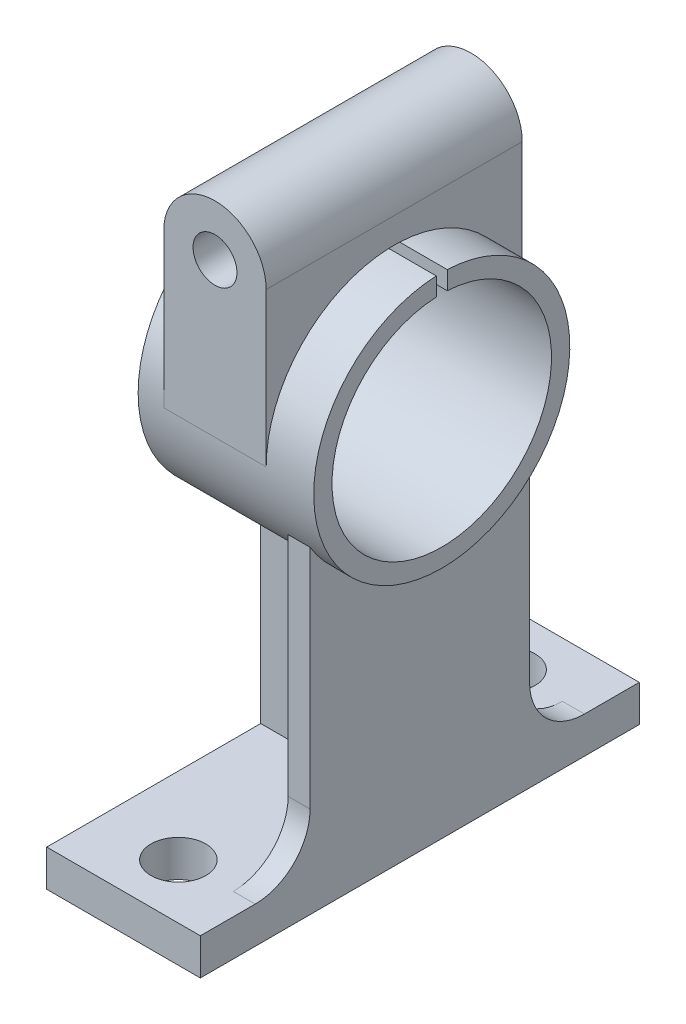
ISO-10303-21;
HEADER;
FILE_DESCRIPTION(('STEP AP214'),'2;1');
FILE_NAME('part.step','',(''),(''),'','','');
FILE_SCHEMA(('AUTOMOTIVE_DESIGN { 1 0 10303 214 1 1 1 1 }'));
ENDSEC;
DATA;
#1=APPLICATION_CONTEXT('core data for automotive mechanical design processes');
#2=APPLICATION_PROTOCOL_DEFINITION('international standard','automotive_design',2000,#1);
#3=PRODUCT_CONTEXT('',#1,'mechanical');
#4=PRODUCT('Part','Part','',(#3));
#5=PRODUCT_RELATED_PRODUCT_CATEGORY('part','',(#4));
#6=PRODUCT_DEFINITION_FORMATION('','',#4);
#7=PRODUCT_DEFINITION_CONTEXT('part definition',#1,'design');
#8=PRODUCT_DEFINITION('design','',#6,#7);
#9=PRODUCT_DEFINITION_SHAPE('','',#8);
#10=(LENGTH_UNIT() NAMED_UNIT(*) SI_UNIT(.MILLI.,.METRE.));
#11=(NAMED_UNIT(*) PLANE_ANGLE_UNIT() SI_UNIT($,.RADIAN.));
#12=(NAMED_UNIT(*) SI_UNIT($,.STERADIAN.) SOLID_ANGLE_UNIT());
#13=UNCERTAINTY_MEASURE_WITH_UNIT(LENGTH_MEASURE(1.E-05),#10,'distance_accuracy_value','');
#14=(GEOMETRIC_REPRESENTATION_CONTEXT(3) GLOBAL_UNCERTAINTY_ASSIGNED_CONTEXT((#13)) GLOBAL_UNIT_ASSIGNED_CONTEXT((#10,
#11,#12)) REPRESENTATION_CONTEXT('',''));
#15=CARTESIAN_POINT('',(0.,0.,0.));
#16=DIRECTION('',(0.,0.,1.));
#17=DIRECTION('',(1.,0.,0.));
#18=AXIS2_PLACEMENT_3D('',#15,#16,#17);
#19=CARTESIAN_POINT('',(0.,10.,0.));
#20=DIRECTION('',(0.,-1.,0.));
#21=DIRECTION('',(0.,0.,-1.));
#22=AXIS2_PLACEMENT_3D('',#19,#20,#21);
#23=PLANE('',#22);
#24=CARTESIAN_POINT('',(21.,10.,-15.));
#25=DIRECTION('',(0.,1.,0.));
#26=DIRECTION('',(0.,0.,1.));
#27=AXIS2_PLACEMENT_3D('',#24,#25,#26);
#28=CIRCLE('',#27,7.5);
#29=CARTESIAN_POINT('',(21.,10.,-7.5));
#30=VERTEX_POINT('',#29);
#31=EDGE_CURVE('E291',#30,#30,#28,.T.);
#32=ORIENTED_EDGE('',*,*,#31,.F.);
#33=EDGE_LOOP('',(#32));
#34=FACE_BOUND('',#33,.T.);
#35=DIRECTION('',(1.,0.,0.));
#36=VECTOR('',#35,1.);
#37=CARTESIAN_POINT('',(0.,10.,-58.5));
#38=LINE('',#37,#36);
#39=CARTESIAN_POINT('',(0.,10.,-58.5));
#40=VERTEX_POINT('',#39);
#41=CARTESIAN_POINT('',(36.,10.,-58.5));
#42=VERTEX_POINT('',#41);
#43=EDGE_CURVE('E387',#40,#42,#38,.T.);
#44=ORIENTED_EDGE('',*,*,#43,.F.);
#45=DIRECTION('',(0.,0.,1.));
#46=VECTOR('',#45,1.);
#47=CARTESIAN_POINT('',(0.,10.,0.));
#48=LINE('',#47,#46);
#49=CARTESIAN_POINT('',(0.,10.,0.));
#50=VERTEX_POINT('',#49);
#51=EDGE_CURVE('E300',#40,#50,#48,.T.);
#52=ORIENTED_EDGE('',*,*,#51,.T.);
#53=DIRECTION('',(1.,0.,0.));
#54=VECTOR('',#53,1.);
#55=CARTESIAN_POINT('',(0.,10.,0.));
#56=LINE('',#55,#54);
#57=CARTESIAN_POINT('',(42.,10.,0.));
#58=VERTEX_POINT('',#57);
#59=EDGE_CURVE('E299',#50,#58,#56,.T.);
#60=ORIENTED_EDGE('',*,*,#59,.T.);
#61=DIRECTION('',(0.,0.,-1.));
#62=VECTOR('',#61,1.);
#63=CARTESIAN_POINT('',(42.,10.,0.));
#64=LINE('',#63,#62);
#65=CARTESIAN_POINT('',(42.,10.,-15.));
#66=VERTEX_POINT('',#65);
#67=EDGE_CURVE('E303',#58,#66,#64,.T.);
#68=ORIENTED_EDGE('',*,*,#67,.T.);
#69=DIRECTION('',(1.,0.,0.));
#70=VECTOR('',#69,1.);
#71=CARTESIAN_POINT('',(36.,10.,-14.9999999999999));
#72=LINE('',#71,#70);
#73=CARTESIAN_POINT('',(36.,10.,-14.9999999999999));
#74=VERTEX_POINT('',#73);
#75=EDGE_CURVE('E278',#74,#66,#72,.T.);
#76=ORIENTED_EDGE('',*,*,#75,.F.);
#77=DIRECTION('',(0.,0.,-1.));
#78=VECTOR('',#77,1.);
#79=CARTESIAN_POINT('',(36.,10.,-14.9999999999999));
#80=LINE('',#79,#78);
#81=EDGE_CURVE('E244',#74,#42,#80,.T.);
#82=ORIENTED_EDGE('',*,*,#81,.T.);
#83=EDGE_LOOP('',(#44,#52,#60,#68,#76,#82));
#84=FACE_BOUND('',#83,.T.);
#85=ADVANCED_FACE('F33',(#34,#84),#23,.F.);
#86=CARTESIAN_POINT('',(21.,10.,-105.));
#87=DIRECTION('',(0.,1.,0.));
#88=DIRECTION('',(0.,0.,-1.));
#89=AXIS2_PLACEMENT_3D('',#86,#87,#88);
#90=CIRCLE('',#89,7.5);
#91=CARTESIAN_POINT('',(21.,10.,-112.5));
#92=VERTEX_POINT('',#91);
#93=EDGE_CURVE('E285',#92,#92,#90,.T.);
#94=ORIENTED_EDGE('',*,*,#93,.F.);
#95=EDGE_LOOP('',(#94));
#96=FACE_BOUND('',#95,.T.);
#97=DIRECTION('',(1.,0.,0.));
#98=VECTOR('',#97,1.);
#99=CARTESIAN_POINT('',(0.,10.,-61.5));
#100=LINE('',#99,#98);
#101=CARTESIAN_POINT('',(0.,10.,-61.5));
#102=VERTEX_POINT('',#101);
#103=CARTESIAN_POINT('',(36.,10.,-61.5));
#104=VERTEX_POINT('',#103);
#105=EDGE_CURVE('E389',#102,#104,#100,.T.);
#106=ORIENTED_EDGE('',*,*,#105,.T.);
#107=CARTESIAN_POINT('',(36.,10.,-105.));
#108=VERTEX_POINT('',#107);
#109=EDGE_CURVE('E243',#104,#108,#80,.T.);
#110=ORIENTED_EDGE('',*,*,#109,.T.);
#111=DIRECTION('',(1.,0.,0.));
#112=VECTOR('',#111,1.);
#113=CARTESIAN_POINT('',(36.,10.,-105.));
#114=LINE('',#113,#112);
#115=CARTESIAN_POINT('',(42.,10.,-105.));
#116=VERTEX_POINT('',#115);
#117=EDGE_CURVE('E275',#108,#116,#114,.T.);
#118=ORIENTED_EDGE('',*,*,#117,.T.);
#119=CARTESIAN_POINT('',(42.,10.,-120.));
#120=VERTEX_POINT('',#119);
#121=EDGE_CURVE('E302',#116,#120,#64,.T.);
#122=ORIENTED_EDGE('',*,*,#121,.T.);
#123=DIRECTION('',(-1.,0.,0.));
#124=VECTOR('',#123,1.);
#125=CARTESIAN_POINT('',(0.,10.,-120.));
#126=LINE('',#125,#124);
#127=CARTESIAN_POINT('',(0.,10.,-120.));
#128=VERTEX_POINT('',#127);
#129=EDGE_CURVE('E305',#120,#128,#126,.T.);
#130=ORIENTED_EDGE('',*,*,#129,.T.);
#131=EDGE_CURVE('E297',#128,#102,#48,.T.);
#132=ORIENTED_EDGE('',*,*,#131,.T.);
#133=EDGE_LOOP('',(#106,#110,#118,#122,#130,#132));
#134=FACE_BOUND('',#133,.T.);
#135=ADVANCED_FACE('F347',(#96,#134),#23,.F.);
#136=CARTESIAN_POINT('',(36.,105.,-60.));
#137=DIRECTION('',(1.,0.,0.));
#138=DIRECTION('',(0.,0.,-1.));
#139=AXIS2_PLACEMENT_3D('',#136,#137,#138);
#140=PLANE('',#139);
#141=DIRECTION('',(0.,1.,0.));
#142=VECTOR('',#141,1.);
#143=CARTESIAN_POINT('',(36.,70.0321576301883,-58.5));
#144=LINE('',#143,#142);
#145=CARTESIAN_POINT('',(36.,70.0321576301883,-58.5));
#146=VERTEX_POINT('',#145);
#147=EDGE_CURVE('E375',#42,#146,#144,.T.);
#148=ORIENTED_EDGE('',*,*,#147,.F.);
#149=ORIENTED_EDGE('',*,*,#81,.F.);
#150=CARTESIAN_POINT('',(36.,25.,-15.));
#151=DIRECTION('',(-1.,0.,0.));
#152=DIRECTION('',(0.,0.,1.));
#153=AXIS2_PLACEMENT_3D('',#150,#151,#152);
#154=CIRCLE('',#153,15.);
#155=CARTESIAN_POINT('',(36.,25.0000000000001,-30.));
#156=VERTEX_POINT('',#155);
#157=EDGE_CURVE('E240',#156,#74,#154,.T.);
#158=ORIENTED_EDGE('',*,*,#157,.F.);
#159=DIRECTION('',(0.,-1.,0.));
#160=VECTOR('',#159,1.);
#161=CARTESIAN_POINT('',(36.,25.0000000000001,-30.));
#162=LINE('',#161,#160);
#163=CARTESIAN_POINT('',(36.,86.9722436226802,-29.9999999999999));
#164=VERTEX_POINT('',#163);
#165=EDGE_CURVE('E236',#164,#156,#162,.T.);
#166=ORIENTED_EDGE('',*,*,#165,.F.);
#167=CARTESIAN_POINT('',(36.,105.,-60.));
#168=DIRECTION('',(-1.,0.,0.));
#169=DIRECTION('',(0.,0.,-1.));
#170=AXIS2_PLACEMENT_3D('',#167,#168,#169);
#171=CIRCLE('',#170,35.);
#172=EDGE_CURVE('E237',#146,#164,#171,.T.);
#173=ORIENTED_EDGE('',*,*,#172,.F.);
#174=EDGE_LOOP('',(#148,#149,#158,#166,#173));
#175=FACE_BOUND('',#174,.T.);
#176=ADVANCED_FACE('F372',(#175),#140,.F.);
#177=DIRECTION('',(0.,-1.,0.));
#178=VECTOR('',#177,1.);
#179=CARTESIAN_POINT('',(36.,70.0321576301883,-61.5));
#180=LINE('',#179,#178);
#181=CARTESIAN_POINT('',(36.,70.0321576301883,-61.5));
#182=VERTEX_POINT('',#181);
#183=EDGE_CURVE('E378',#182,#104,#180,.T.);
#184=ORIENTED_EDGE('',*,*,#183,.F.);
#185=CARTESIAN_POINT('',(36.,86.97224362268,-89.9999999999996));
#186=VERTEX_POINT('',#185);
#187=EDGE_CURVE('E233',#186,#182,#171,.T.);
#188=ORIENTED_EDGE('',*,*,#187,.F.);
#189=DIRECTION('',(0.,1.,0.));
#190=VECTOR('',#189,1.);
#191=CARTESIAN_POINT('',(36.,25.0000000000001,-90.));
#192=LINE('',#191,#190);
#193=CARTESIAN_POINT('',(36.,25.0000000000001,-90.));
#194=VERTEX_POINT('',#193);
#195=EDGE_CURVE('E250',#194,#186,#192,.T.);
#196=ORIENTED_EDGE('',*,*,#195,.F.);
#197=CARTESIAN_POINT('',(36.,25.,-105.));
#198=DIRECTION('',(-1.,0.,0.));
#199=DIRECTION('',(0.,0.,-1.));
#200=AXIS2_PLACEMENT_3D('',#197,#198,#199);
#201=CIRCLE('',#200,15.);
#202=EDGE_CURVE('E247',#108,#194,#201,.T.);
#203=ORIENTED_EDGE('',*,*,#202,.F.);
#204=ORIENTED_EDGE('',*,*,#109,.F.);
#205=EDGE_LOOP('',(#184,#188,#196,#203,#204));
#206=FACE_BOUND('',#205,.T.);
#207=ADVANCED_FACE('F469',(#206),#140,.F.);
#208=CARTESIAN_POINT('',(0.,105.,-60.));
#209=DIRECTION('',(1.,0.,0.));
#210=DIRECTION('',(0.,0.,-1.));
#211=AXIS2_PLACEMENT_3D('',#208,#209,#210);
#212=CYLINDRICAL_SURFACE('',#211,35.);
#213=CARTESIAN_POINT('',(35.,105.,-60.));
#214=DIRECTION('',(1.,0.,0.));
#215=DIRECTION('',(0.,0.,-1.));
#216=AXIS2_PLACEMENT_3D('',#213,#214,#215);
#217=CIRCLE('',#216,35.);
#218=CARTESIAN_POINT('',(35.,105.,-25.));
#219=VERTEX_POINT('',#218);
#220=CARTESIAN_POINT('',(35.,139.967842369812,-58.5));
#221=VERTEX_POINT('',#220);
#222=EDGE_CURVE('E210',#219,#221,#217,.F.);
#223=ORIENTED_EDGE('',*,*,#222,.F.);
#224=DIRECTION('',(1.,0.,0.));
#225=VECTOR('',#224,1.);
#226=CARTESIAN_POINT('',(7.,105.,-25.));
#227=LINE('',#226,#225);
#228=CARTESIAN_POINT('',(7.,105.,-25.));
#229=VERTEX_POINT('',#228);
#230=EDGE_CURVE('E715',#229,#219,#227,.T.);
#231=ORIENTED_EDGE('',*,*,#230,.F.);
#232=CARTESIAN_POINT('',(7.,105.,-60.));
#233=DIRECTION('',(-1.,0.,0.));
#234=DIRECTION('',(0.,0.,1.));
#235=AXIS2_PLACEMENT_3D('',#232,#233,#234);
#236=CIRCLE('',#235,35.);
#237=CARTESIAN_POINT('',(7.,139.967842369812,-58.5));
#238=VERTEX_POINT('',#237);
#239=EDGE_CURVE('E217',#238,#229,#236,.F.);
#240=ORIENTED_EDGE('',*,*,#239,.F.);
#241=DIRECTION('',(1.,0.,0.));
#242=VECTOR('',#241,1.);
#243=CARTESIAN_POINT('',(0.,139.967842369812,-58.5));
#244=LINE('',#243,#242);
#245=CARTESIAN_POINT('',(0.,139.967842369812,-58.5));
#246=VERTEX_POINT('',#245);
#247=EDGE_CURVE('E258',#246,#238,#244,.T.);
#248=ORIENTED_EDGE('',*,*,#247,.F.);
#249=CARTESIAN_POINT('',(0.,105.,-60.));
#250=DIRECTION('',(1.,0.,0.));
#251=DIRECTION('',(0.,0.,-1.));
#252=AXIS2_PLACEMENT_3D('',#249,#250,#251);
#253=CIRCLE('',#252,35.);
#254=CARTESIAN_POINT('',(0.,70.0321576301883,-58.4999999999999));
#255=VERTEX_POINT('',#254);
#256=EDGE_CURVE('E405',#246,#255,#253,.T.);
#257=ORIENTED_EDGE('',*,*,#256,.T.);
#258=DIRECTION('',(1.,0.,0.));
#259=VECTOR('',#258,1.);
#260=CARTESIAN_POINT('',(0.,70.0321576301883,-58.4999999999999));
#261=LINE('',#260,#259);
#262=EDGE_CURVE('E393',#255,#146,#261,.T.);
#263=ORIENTED_EDGE('',*,*,#262,.T.);
#264=ORIENTED_EDGE('',*,*,#172,.T.);
#265=DIRECTION('',(1.,0.,0.));
#266=VECTOR('',#265,1.);
#267=CARTESIAN_POINT('',(36.,86.97224362268,-29.9999999999996));
#268=LINE('',#267,#266);
#269=CARTESIAN_POINT('',(42.,86.97224362268,-29.9999999999996));
#270=VERTEX_POINT('',#269);
#271=EDGE_CURVE('E253',#164,#270,#268,.T.);
#272=ORIENTED_EDGE('',*,*,#271,.T.);
#273=CARTESIAN_POINT('',(42.,105.,-60.));
#274=DIRECTION('',(-1.,0.,0.));
#275=DIRECTION('',(0.,0.,-1.));
#276=AXIS2_PLACEMENT_3D('',#273,#274,#275);
#277=CIRCLE('',#276,35.);
#278=CARTESIAN_POINT('',(42.,86.97224362268,-89.9999999999996));
#279=VERTEX_POINT('',#278);
#280=EDGE_CURVE('E254',#279,#270,#277,.T.);
#281=ORIENTED_EDGE('',*,*,#280,.F.);
#282=DIRECTION('',(1.,0.,0.));
#283=VECTOR('',#282,1.);
#284=CARTESIAN_POINT('',(36.,86.97224362268,-89.9999999999996));
#285=LINE('',#284,#283);
#286=EDGE_CURVE('E270',#186,#279,#285,.T.);
#287=ORIENTED_EDGE('',*,*,#286,.F.);
#288=ORIENTED_EDGE('',*,*,#187,.T.);
#289=DIRECTION('',(1.,0.,0.));
#290=VECTOR('',#289,1.);
#291=CARTESIAN_POINT('',(0.,70.0321576301883,-61.5));
#292=LINE('',#291,#290);
#293=CARTESIAN_POINT('',(0.,70.0321576301883,-61.5));
#294=VERTEX_POINT('',#293);
#295=EDGE_CURVE('E391',#294,#182,#292,.T.);
#296=ORIENTED_EDGE('',*,*,#295,.F.);
#297=CARTESIAN_POINT('',(0.,139.967842369812,-61.5));
#298=VERTEX_POINT('',#297);
#299=EDGE_CURVE('E404',#294,#298,#253,.T.);
#300=ORIENTED_EDGE('',*,*,#299,.T.);
#301=DIRECTION('',(1.,0.,0.));
#302=VECTOR('',#301,1.);
#303=CARTESIAN_POINT('',(0.,139.967842369812,-61.5));
#304=LINE('',#303,#302);
#305=CARTESIAN_POINT('',(7.,139.967842369812,-61.5));
#306=VERTEX_POINT('',#305);
#307=EDGE_CURVE('E223',#298,#306,#304,.T.);
#308=ORIENTED_EDGE('',*,*,#307,.T.);
#309=CARTESIAN_POINT('',(7.,105.,-95.));
#310=VERTEX_POINT('',#309);
#311=EDGE_CURVE('E48',#310,#306,#236,.F.);
#312=ORIENTED_EDGE('',*,*,#311,.F.);
#313=DIRECTION('',(1.,0.,0.));
#314=VECTOR('',#313,1.);
#315=CARTESIAN_POINT('',(7.,105.,-95.));
#316=LINE('',#315,#314);
#317=CARTESIAN_POINT('',(35.,105.,-95.));
#318=VERTEX_POINT('',#317);
#319=EDGE_CURVE('E52',#310,#318,#316,.T.);
#320=ORIENTED_EDGE('',*,*,#319,.T.);
#321=CARTESIAN_POINT('',(35.,139.967842369812,-61.5));
#322=VERTEX_POINT('',#321);
#323=EDGE_CURVE('E207',#322,#318,#217,.F.);
#324=ORIENTED_EDGE('',*,*,#323,.F.);
#325=CARTESIAN_POINT('',(48.,139.967842369812,-61.5));
#326=VERTEX_POINT('',#325);
#327=EDGE_CURVE('E215',#322,#326,#304,.T.);
#328=ORIENTED_EDGE('',*,*,#327,.T.);
#329=CARTESIAN_POINT('',(48.,105.,-60.));
#330=DIRECTION('',(1.,0.,0.));
#331=DIRECTION('',(0.,0.,-1.));
#332=AXIS2_PLACEMENT_3D('',#329,#330,#331);
#333=CIRCLE('',#332,35.);
#334=CARTESIAN_POINT('',(48.,139.967842369812,-58.5));
#335=VERTEX_POINT('',#334);
#336=EDGE_CURVE('E395',#335,#326,#333,.T.);
#337=ORIENTED_EDGE('',*,*,#336,.F.);
#338=EDGE_CURVE('E413',#221,#335,#244,.T.);
#339=ORIENTED_EDGE('',*,*,#338,.F.);
#340=EDGE_LOOP('',(#223,#231,#240,#248,#257,#263,#264,#272,#281,#287,#288,#296,#300,#308,#312,
#320,#324,#328,#337,#339));
#341=FACE_BOUND('',#340,.T.);
#342=ADVANCED_FACE('F213',(#341),#212,.T.);
#343=CARTESIAN_POINT('',(0.,0.,0.));
#344=DIRECTION('',(0.,-1.,0.));
#345=DIRECTION('',(0.,0.,-1.));
#346=AXIS2_PLACEMENT_3D('',#343,#344,#345);
#347=PLANE('',#346);
#348=CARTESIAN_POINT('',(21.,0.,-15.));
#349=DIRECTION('',(0.,1.,0.));
#350=DIRECTION('',(0.,0.,1.));
#351=AXIS2_PLACEMENT_3D('',#348,#349,#350);
#352=CIRCLE('',#351,7.5);
#353=CARTESIAN_POINT('',(21.,0.,-7.5));
#354=VERTEX_POINT('',#353);
#355=EDGE_CURVE('E288',#354,#354,#352,.T.);
#356=ORIENTED_EDGE('',*,*,#355,.T.);
#357=EDGE_LOOP('',(#356));
#358=FACE_BOUND('',#357,.T.);
#359=DIRECTION('',(0.,0.,1.));
#360=VECTOR('',#359,1.);
#361=CARTESIAN_POINT('',(0.,0.,0.));
#362=LINE('',#361,#360);
#363=CARTESIAN_POINT('',(0.,0.,-120.));
#364=VERTEX_POINT('',#363);
#365=CARTESIAN_POINT('',(0.,0.,0.));
#366=VERTEX_POINT('',#365);
#367=EDGE_CURVE('E294',#364,#366,#362,.T.);
#368=ORIENTED_EDGE('',*,*,#367,.F.);
#369=DIRECTION('',(-1.,0.,0.));
#370=VECTOR('',#369,1.);
#371=CARTESIAN_POINT('',(0.,0.,-120.));
#372=LINE('',#371,#370);
#373=CARTESIAN_POINT('',(42.,0.,-120.));
#374=VERTEX_POINT('',#373);
#375=EDGE_CURVE('E314',#374,#364,#372,.T.);
#376=ORIENTED_EDGE('',*,*,#375,.F.);
#377=DIRECTION('',(0.,0.,-1.));
#378=VECTOR('',#377,1.);
#379=CARTESIAN_POINT('',(42.,0.,0.));
#380=LINE('',#379,#378);
#381=CARTESIAN_POINT('',(42.,0.,0.));
#382=VERTEX_POINT('',#381);
#383=EDGE_CURVE('E312',#382,#374,#380,.T.);
#384=ORIENTED_EDGE('',*,*,#383,.F.);
#385=DIRECTION('',(1.,0.,0.));
#386=VECTOR('',#385,1.);
#387=CARTESIAN_POINT('',(0.,0.,0.));
#388=LINE('',#387,#386);
#389=EDGE_CURVE('E310',#366,#382,#388,.T.);
#390=ORIENTED_EDGE('',*,*,#389,.F.);
#391=EDGE_LOOP('',(#368,#376,#384,#390));
#392=FACE_BOUND('',#391,.T.);
#393=CARTESIAN_POINT('',(21.,0.,-105.));
#394=DIRECTION('',(0.,1.,0.));
#395=DIRECTION('',(0.,0.,-1.));
#396=AXIS2_PLACEMENT_3D('',#393,#394,#395);
#397=CIRCLE('',#396,7.5);
#398=CARTESIAN_POINT('',(21.,0.,-112.5));
#399=VERTEX_POINT('',#398);
#400=EDGE_CURVE('E272',#399,#399,#397,.T.);
#401=ORIENTED_EDGE('',*,*,#400,.T.);
#402=EDGE_LOOP('',(#401));
#403=FACE_BOUND('',#402,.T.);
#404=ADVANCED_FACE('F336',(#358,#392,#403),#347,.T.);
#405=CARTESIAN_POINT('',(0.,10.,0.));
#406=DIRECTION('',(1.,0.,0.));
#407=DIRECTION('',(0.,0.,-1.));
#408=AXIS2_PLACEMENT_3D('',#405,#406,#407);
#409=PLANE('',#408);
#410=ORIENTED_EDGE('',*,*,#367,.T.);
#411=DIRECTION('',(0.,-1.,0.));
#412=VECTOR('',#411,1.);
#413=CARTESIAN_POINT('',(0.,10.,0.));
#414=LINE('',#413,#412);
#415=EDGE_CURVE('E41',#50,#366,#414,.T.);
#416=ORIENTED_EDGE('',*,*,#415,.F.);
#417=ORIENTED_EDGE('',*,*,#51,.F.);
#418=DIRECTION('',(0.,1.,0.));
#419=VECTOR('',#418,1.);
#420=CARTESIAN_POINT('',(0.,70.0321576301883,-58.5));
#421=LINE('',#420,#419);
#422=EDGE_CURVE('E381',#40,#255,#421,.T.);
#423=ORIENTED_EDGE('',*,*,#422,.T.);
#424=ORIENTED_EDGE('',*,*,#256,.F.);
#425=DIRECTION('',(0.,1.,0.));
#426=VECTOR('',#425,1.);
#427=CARTESIAN_POINT('',(0.,134.962476533157,-58.5));
#428=LINE('',#427,#426);
#429=CARTESIAN_POINT('',(0.,134.962476533157,-58.5));
#430=VERTEX_POINT('',#429);
#431=EDGE_CURVE('E224',#430,#246,#428,.T.);
#432=ORIENTED_EDGE('',*,*,#431,.F.);
#433=CARTESIAN_POINT('',(0.,105.,-60.));
#434=DIRECTION('',(-1.,0.,0.));
#435=DIRECTION('',(0.,0.,-1.));
#436=AXIS2_PLACEMENT_3D('',#433,#434,#435);
#437=CIRCLE('',#436,30.);
#438=CARTESIAN_POINT('',(0.,134.962476533157,-61.5));
#439=VERTEX_POINT('',#438);
#440=EDGE_CURVE('E228',#439,#430,#437,.T.);
#441=ORIENTED_EDGE('',*,*,#440,.F.);
#442=DIRECTION('',(0.,-1.,0.));
#443=VECTOR('',#442,1.);
#444=CARTESIAN_POINT('',(0.,134.962476533157,-61.5));
#445=LINE('',#444,#443);
#446=EDGE_CURVE('E407',#298,#439,#445,.T.);
#447=ORIENTED_EDGE('',*,*,#446,.F.);
#448=ORIENTED_EDGE('',*,*,#299,.F.);
#449=DIRECTION('',(0.,-1.,0.));
#450=VECTOR('',#449,1.);
#451=CARTESIAN_POINT('',(0.,70.0321576301883,-61.5));
#452=LINE('',#451,#450);
#453=EDGE_CURVE('E384',#294,#102,#452,.T.);
#454=ORIENTED_EDGE('',*,*,#453,.T.);
#455=ORIENTED_EDGE('',*,*,#131,.F.);
#456=DIRECTION('',(0.,-1.,0.));
#457=VECTOR('',#456,1.);
#458=CARTESIAN_POINT('',(0.,10.,-120.));
#459=LINE('',#458,#457);
#460=EDGE_CURVE('E307',#128,#364,#459,.T.);
#461=ORIENTED_EDGE('',*,*,#460,.T.);
#462=EDGE_LOOP('',(#410,#416,#417,#423,#424,#432,#441,#447,#448,#454,#455,#461));
#463=FACE_BOUND('',#462,.T.);
#464=ADVANCED_FACE('F35',(#463),#409,.F.);
#465=CARTESIAN_POINT('',(0.,10.,0.));
#466=DIRECTION('',(0.,0.,-1.));
#467=DIRECTION('',(-1.,0.,0.));
#468=AXIS2_PLACEMENT_3D('',#465,#466,#467);
#469=PLANE('',#468);
#470=ORIENTED_EDGE('',*,*,#389,.T.);
#471=DIRECTION('',(0.,-1.,0.));
#472=VECTOR('',#471,1.);
#473=CARTESIAN_POINT('',(42.,10.,0.));
#474=LINE('',#473,#472);
#475=EDGE_CURVE('E321',#58,#382,#474,.T.);
#476=ORIENTED_EDGE('',*,*,#475,.F.);
#477=ORIENTED_EDGE('',*,*,#59,.F.);
#478=ORIENTED_EDGE('',*,*,#415,.T.);
#479=EDGE_LOOP('',(#470,#476,#477,#478));
#480=FACE_BOUND('',#479,.T.);
#481=ADVANCED_FACE('F327',(#480),#469,.F.);
#482=CARTESIAN_POINT('',(42.,10.,0.));
#483=DIRECTION('',(-1.,0.,0.));
#484=DIRECTION('',(0.,0.,1.));
#485=AXIS2_PLACEMENT_3D('',#482,#483,#484);
#486=PLANE('',#485);
#487=ORIENTED_EDGE('',*,*,#383,.T.);
#488=DIRECTION('',(0.,-1.,0.));
#489=VECTOR('',#488,1.);
#490=CARTESIAN_POINT('',(42.,10.,-120.));
#491=LINE('',#490,#489);
#492=EDGE_CURVE('E318',#120,#374,#491,.T.);
#493=ORIENTED_EDGE('',*,*,#492,.F.);
#494=ORIENTED_EDGE('',*,*,#121,.F.);
#495=CARTESIAN_POINT('',(42.,25.,-105.));
#496=DIRECTION('',(-1.,0.,0.));
#497=DIRECTION('',(0.,0.,-1.));
#498=AXIS2_PLACEMENT_3D('',#495,#496,#497);
#499=CIRCLE('',#498,15.);
#500=CARTESIAN_POINT('',(42.,25.0000000000001,-90.));
#501=VERTEX_POINT('',#500);
#502=EDGE_CURVE('E264',#116,#501,#499,.T.);
#503=ORIENTED_EDGE('',*,*,#502,.T.);
#504=DIRECTION('',(0.,1.,0.));
#505=VECTOR('',#504,1.);
#506=CARTESIAN_POINT('',(42.,25.0000000000001,-90.));
#507=LINE('',#506,#505);
#508=EDGE_CURVE('E267',#501,#279,#507,.T.);
#509=ORIENTED_EDGE('',*,*,#508,.T.);
#510=ORIENTED_EDGE('',*,*,#280,.T.);
#511=DIRECTION('',(0.,-1.,0.));
#512=VECTOR('',#511,1.);
#513=CARTESIAN_POINT('',(42.,25.0000000000001,-30.));
#514=LINE('',#513,#512);
#515=CARTESIAN_POINT('',(42.,25.0000000000001,-30.));
#516=VERTEX_POINT('',#515);
#517=EDGE_CURVE('E257',#270,#516,#514,.T.);
#518=ORIENTED_EDGE('',*,*,#517,.T.);
#519=CARTESIAN_POINT('',(42.,25.,-15.));
#520=DIRECTION('',(-1.,0.,0.));
#521=DIRECTION('',(0.,0.,1.));
#522=AXIS2_PLACEMENT_3D('',#519,#520,#521);
#523=CIRCLE('',#522,15.);
#524=EDGE_CURVE('E261',#516,#66,#523,.T.);
#525=ORIENTED_EDGE('',*,*,#524,.T.);
#526=ORIENTED_EDGE('',*,*,#67,.F.);
#527=ORIENTED_EDGE('',*,*,#475,.T.);
#528=EDGE_LOOP('',(#487,#493,#494,#503,#509,#510,#518,#525,#526,#527));
#529=FACE_BOUND('',#528,.T.);
#530=ADVANCED_FACE('F341',(#529),#486,.F.);
#531=CARTESIAN_POINT('',(0.,10.,-120.));
#532=DIRECTION('',(0.,0.,1.));
#533=DIRECTION('',(1.,0.,0.));
#534=AXIS2_PLACEMENT_3D('',#531,#532,#533);
#535=PLANE('',#534);
#536=ORIENTED_EDGE('',*,*,#375,.T.);
#537=ORIENTED_EDGE('',*,*,#460,.F.);
#538=ORIENTED_EDGE('',*,*,#129,.F.);
#539=ORIENTED_EDGE('',*,*,#492,.T.);
#540=EDGE_LOOP('',(#536,#537,#538,#539));
#541=FACE_BOUND('',#540,.T.);
#542=ADVANCED_FACE('F345',(#541),#535,.F.);
#543=CARTESIAN_POINT('',(21.,10.,-15.));
#544=DIRECTION('',(0.,-1.,0.));
#545=DIRECTION('',(0.,0.,-1.));
#546=AXIS2_PLACEMENT_3D('',#543,#544,#545);
#547=CYLINDRICAL_SURFACE('',#546,7.5);
#548=ORIENTED_EDGE('',*,*,#31,.T.);
#549=EDGE_LOOP('',(#548));
#550=FACE_BOUND('',#549,.T.);
#551=ORIENTED_EDGE('',*,*,#355,.F.);
#552=EDGE_LOOP('',(#551));
#553=FACE_BOUND('',#552,.T.);
#554=ADVANCED_FACE('F443',(#550,#553),#547,.F.);
#555=CARTESIAN_POINT('',(21.,10.,-105.));
#556=DIRECTION('',(0.,-1.,0.));
#557=DIRECTION('',(0.,0.,-1.));
#558=AXIS2_PLACEMENT_3D('',#555,#556,#557);
#559=CYLINDRICAL_SURFACE('',#558,7.5);
#560=ORIENTED_EDGE('',*,*,#93,.T.);
#561=EDGE_LOOP('',(#560));
#562=FACE_BOUND('',#561,.T.);
#563=ORIENTED_EDGE('',*,*,#400,.F.);
#564=EDGE_LOOP('',(#563));
#565=FACE_BOUND('',#564,.T.);
#566=ADVANCED_FACE('F524',(#562,#565),#559,.F.);
#567=CARTESIAN_POINT('',(36.,25.0000000000001,-90.));
#568=DIRECTION('',(0.,0.,-1.));
#569=DIRECTION('',(0.,1.,0.));
#570=AXIS2_PLACEMENT_3D('',#567,#568,#569);
#571=PLANE('',#570);
#572=ORIENTED_EDGE('',*,*,#508,.F.);
#573=DIRECTION('',(1.,0.,0.));
#574=VECTOR('',#573,1.);
#575=CARTESIAN_POINT('',(36.,25.0000000000001,-90.));
#576=LINE('',#575,#574);
#577=EDGE_CURVE('E273',#194,#501,#576,.T.);
#578=ORIENTED_EDGE('',*,*,#577,.F.);
#579=ORIENTED_EDGE('',*,*,#195,.T.);
#580=ORIENTED_EDGE('',*,*,#286,.T.);
#581=EDGE_LOOP('',(#572,#578,#579,#580));
#582=FACE_BOUND('',#581,.T.);
#583=ADVANCED_FACE('F355',(#582),#571,.T.);
#584=CARTESIAN_POINT('',(36.,25.,-105.));
#585=DIRECTION('',(1.,0.,0.));
#586=DIRECTION('',(0.,0.,-1.));
#587=AXIS2_PLACEMENT_3D('',#584,#585,#586);
#588=CYLINDRICAL_SURFACE('',#587,15.);
#589=ORIENTED_EDGE('',*,*,#502,.F.);
#590=ORIENTED_EDGE('',*,*,#117,.F.);
#591=ORIENTED_EDGE('',*,*,#202,.T.);
#592=ORIENTED_EDGE('',*,*,#577,.T.);
#593=EDGE_LOOP('',(#589,#590,#591,#592));
#594=FACE_BOUND('',#593,.T.);
#595=ADVANCED_FACE('F523',(#594),#588,.F.);
#596=CARTESIAN_POINT('',(36.,25.,-15.));
#597=DIRECTION('',(1.,0.,0.));
#598=DIRECTION('',(0.,0.,-1.));
#599=AXIS2_PLACEMENT_3D('',#596,#597,#598);
#600=CYLINDRICAL_SURFACE('',#599,15.);
#601=ORIENTED_EDGE('',*,*,#524,.F.);
#602=DIRECTION('',(1.,0.,0.));
#603=VECTOR('',#602,1.);
#604=CARTESIAN_POINT('',(36.,25.0000000000001,-30.));
#605=LINE('',#604,#603);
#606=EDGE_CURVE('E281',#156,#516,#605,.T.);
#607=ORIENTED_EDGE('',*,*,#606,.F.);
#608=ORIENTED_EDGE('',*,*,#157,.T.);
#609=ORIENTED_EDGE('',*,*,#75,.T.);
#610=EDGE_LOOP('',(#601,#607,#608,#609));
#611=FACE_BOUND('',#610,.T.);
#612=ADVANCED_FACE('F367',(#611),#600,.F.);
#613=CARTESIAN_POINT('',(36.,25.0000000000001,-30.));
#614=DIRECTION('',(0.,0.,1.));
#615=DIRECTION('',(0.,-1.,0.));
#616=AXIS2_PLACEMENT_3D('',#613,#614,#615);
#617=PLANE('',#616);
#618=ORIENTED_EDGE('',*,*,#517,.F.);
#619=ORIENTED_EDGE('',*,*,#271,.F.);
#620=ORIENTED_EDGE('',*,*,#165,.T.);
#621=ORIENTED_EDGE('',*,*,#606,.T.);
#622=EDGE_LOOP('',(#618,#619,#620,#621));
#623=FACE_BOUND('',#622,.T.);
#624=ADVANCED_FACE('F363',(#623),#617,.T.);
#625=CARTESIAN_POINT('',(0.,134.962476533157,-58.5));
#626=DIRECTION('',(0.,0.,-1.));
#627=DIRECTION('',(-1.,0.,0.));
#628=AXIS2_PLACEMENT_3D('',#625,#626,#627);
#629=PLANE('',#628);
#630=ORIENTED_EDGE('',*,*,#247,.T.);
#631=DIRECTION('',(1.,0.,0.));
#632=VECTOR('',#631,1.);
#633=CARTESIAN_POINT('',(-22.,139.967842369812,-58.5));
#634=LINE('',#633,#632);
#635=EDGE_CURVE('E201',#238,#221,#634,.T.);
#636=ORIENTED_EDGE('',*,*,#635,.T.);
#637=ORIENTED_EDGE('',*,*,#338,.T.);
#638=DIRECTION('',(0.,1.,0.));
#639=VECTOR('',#638,1.);
#640=CARTESIAN_POINT('',(48.,134.962476533157,-58.5));
#641=LINE('',#640,#639);
#642=CARTESIAN_POINT('',(48.,134.962476533157,-58.5));
#643=VERTEX_POINT('',#642);
#644=EDGE_CURVE('E401',#643,#335,#641,.T.);
#645=ORIENTED_EDGE('',*,*,#644,.F.);
#646=DIRECTION('',(1.,0.,0.));
#647=VECTOR('',#646,1.);
#648=CARTESIAN_POINT('',(0.,134.962476533157,-58.5));
#649=LINE('',#648,#647);
#650=EDGE_CURVE('E414',#430,#643,#649,.T.);
#651=ORIENTED_EDGE('',*,*,#650,.F.);
#652=ORIENTED_EDGE('',*,*,#431,.T.);
#653=EDGE_LOOP('',(#630,#636,#637,#645,#651,#652));
#654=FACE_BOUND('',#653,.T.);
#655=ADVANCED_FACE('F424',(#654),#629,.T.);
#656=CARTESIAN_POINT('',(0.,105.,-60.));
#657=DIRECTION('',(1.,0.,0.));
#658=DIRECTION('',(0.,0.,-1.));
#659=AXIS2_PLACEMENT_3D('',#656,#657,#658);
#660=CYLINDRICAL_SURFACE('',#659,30.);
#661=CARTESIAN_POINT('',(48.,105.,-60.));
#662=DIRECTION('',(-1.,0.,0.));
#663=DIRECTION('',(0.,0.,-1.));
#664=AXIS2_PLACEMENT_3D('',#661,#662,#663);
#665=CIRCLE('',#664,30.);
#666=CARTESIAN_POINT('',(48.,134.962476533157,-61.5));
#667=VERTEX_POINT('',#666);
#668=EDGE_CURVE('E398',#667,#643,#665,.T.);
#669=ORIENTED_EDGE('',*,*,#668,.F.);
#670=DIRECTION('',(1.,0.,0.));
#671=VECTOR('',#670,1.);
#672=CARTESIAN_POINT('',(0.,134.962476533157,-61.5));
#673=LINE('',#672,#671);
#674=EDGE_CURVE('E226',#439,#667,#673,.T.);
#675=ORIENTED_EDGE('',*,*,#674,.F.);
#676=ORIENTED_EDGE('',*,*,#440,.T.);
#677=ORIENTED_EDGE('',*,*,#650,.T.);
#678=EDGE_LOOP('',(#669,#675,#676,#677));
#679=FACE_BOUND('',#678,.T.);
#680=ADVANCED_FACE('F422',(#679),#660,.F.);
#681=CARTESIAN_POINT('',(0.,134.962476533157,-61.5));
#682=DIRECTION('',(0.,0.,1.));
#683=DIRECTION('',(1.,0.,0.));
#684=AXIS2_PLACEMENT_3D('',#681,#682,#683);
#685=PLANE('',#684);
#686=ORIENTED_EDGE('',*,*,#674,.T.);
#687=DIRECTION('',(0.,-1.,0.));
#688=VECTOR('',#687,1.);
#689=CARTESIAN_POINT('',(48.,134.962476533157,-61.5));
#690=LINE('',#689,#688);
#691=EDGE_CURVE('E221',#326,#667,#690,.T.);
#692=ORIENTED_EDGE('',*,*,#691,.F.);
#693=ORIENTED_EDGE('',*,*,#327,.F.);
#694=DIRECTION('',(1.,0.,0.));
#695=VECTOR('',#694,1.);
#696=CARTESIAN_POINT('',(-22.,139.967842369812,-61.5));
#697=LINE('',#696,#695);
#698=EDGE_CURVE('E192',#306,#322,#697,.T.);
#699=ORIENTED_EDGE('',*,*,#698,.F.);
#700=ORIENTED_EDGE('',*,*,#307,.F.);
#701=ORIENTED_EDGE('',*,*,#446,.T.);
#702=EDGE_LOOP('',(#686,#692,#693,#699,#700,#701));
#703=FACE_BOUND('',#702,.T.);
#704=ADVANCED_FACE('F219',(#703),#685,.T.);
#705=CARTESIAN_POINT('',(48.,105.,-60.));
#706=DIRECTION('',(1.,0.,0.));
#707=DIRECTION('',(0.,0.,-1.));
#708=AXIS2_PLACEMENT_3D('',#705,#706,#707);
#709=PLANE('',#708);
#710=ORIENTED_EDGE('',*,*,#336,.T.);
#711=ORIENTED_EDGE('',*,*,#691,.T.);
#712=ORIENTED_EDGE('',*,*,#668,.T.);
#713=ORIENTED_EDGE('',*,*,#644,.T.);
#714=EDGE_LOOP('',(#710,#711,#712,#713));
#715=FACE_BOUND('',#714,.T.);
#716=ADVANCED_FACE('F420',(#715),#709,.T.);
#717=CARTESIAN_POINT('',(0.,70.0321576301883,-58.5));
#718=DIRECTION('',(0.,0.,-1.));
#719=DIRECTION('',(-1.,0.,0.));
#720=AXIS2_PLACEMENT_3D('',#717,#718,#719);
#721=PLANE('',#720);
#722=ORIENTED_EDGE('',*,*,#147,.T.);
#723=ORIENTED_EDGE('',*,*,#262,.F.);
#724=ORIENTED_EDGE('',*,*,#422,.F.);
#725=ORIENTED_EDGE('',*,*,#43,.T.);
#726=EDGE_LOOP('',(#722,#723,#724,#725));
#727=FACE_BOUND('',#726,.T.);
#728=ADVANCED_FACE('F501',(#727),#721,.F.);
#729=CARTESIAN_POINT('',(0.,70.0321576301883,-61.5));
#730=DIRECTION('',(0.,0.,1.));
#731=DIRECTION('',(1.,0.,0.));
#732=AXIS2_PLACEMENT_3D('',#729,#730,#731);
#733=PLANE('',#732);
#734=ORIENTED_EDGE('',*,*,#183,.T.);
#735=ORIENTED_EDGE('',*,*,#105,.F.);
#736=ORIENTED_EDGE('',*,*,#453,.F.);
#737=ORIENTED_EDGE('',*,*,#295,.T.);
#738=EDGE_LOOP('',(#734,#735,#736,#737));
#739=FACE_BOUND('',#738,.T.);
#740=ADVANCED_FACE('F590',(#739),#733,.F.);
#741=CARTESIAN_POINT('',(21.,147.,-95.));
#742=DIRECTION('',(0.,0.,1.));
#743=DIRECTION('',(1.,0.,0.));
#744=AXIS2_PLACEMENT_3D('',#741,#742,#743);
#745=CYLINDRICAL_SURFACE('',#744,14.);
#746=CARTESIAN_POINT('',(21.,147.,-25.));
#747=DIRECTION('',(0.,0.,1.));
#748=DIRECTION('',(1.,0.,0.));
#749=AXIS2_PLACEMENT_3D('',#746,#747,#748);
#750=CIRCLE('',#749,14.);
#751=CARTESIAN_POINT('',(35.,147.,-25.));
#752=VERTEX_POINT('',#751);
#753=CARTESIAN_POINT('',(7.,147.,-25.));
#754=VERTEX_POINT('',#753);
#755=EDGE_CURVE('E696',#752,#754,#750,.T.);
#756=ORIENTED_EDGE('',*,*,#755,.F.);
#757=DIRECTION('',(0.,0.,1.));
#758=VECTOR('',#757,1.);
#759=CARTESIAN_POINT('',(35.,147.,-95.));
#760=LINE('',#759,#758);
#761=CARTESIAN_POINT('',(35.,147.,-95.));
#762=VERTEX_POINT('',#761);
#763=EDGE_CURVE('E720',#762,#752,#760,.T.);
#764=ORIENTED_EDGE('',*,*,#763,.F.);
#765=CARTESIAN_POINT('',(21.,147.,-95.));
#766=DIRECTION('',(0.,0.,1.));
#767=DIRECTION('',(1.,0.,0.));
#768=AXIS2_PLACEMENT_3D('',#765,#766,#767);
#769=CIRCLE('',#768,14.);
#770=CARTESIAN_POINT('',(7.,147.,-95.));
#771=VERTEX_POINT('',#770);
#772=EDGE_CURVE('E699',#762,#771,#769,.T.);
#773=ORIENTED_EDGE('',*,*,#772,.T.);
#774=DIRECTION('',(0.,0.,1.));
#775=VECTOR('',#774,1.);
#776=CARTESIAN_POINT('',(7.,147.,-95.));
#777=LINE('',#776,#775);
#778=EDGE_CURVE('E709',#771,#754,#777,.T.);
#779=ORIENTED_EDGE('',*,*,#778,.T.);
#780=EDGE_LOOP('',(#756,#764,#773,#779));
#781=FACE_BOUND('',#780,.T.);
#782=ADVANCED_FACE('F598',(#781),#745,.T.);
#783=CARTESIAN_POINT('',(35.,147.,-95.));
#784=DIRECTION('',(1.,0.,0.));
#785=DIRECTION('',(0.,0.,-1.));
#786=AXIS2_PLACEMENT_3D('',#783,#784,#785);
#787=PLANE('',#786);
#788=CARTESIAN_POINT('',(35.,105.,-60.));
#789=DIRECTION('',(1.,0.,0.));
#790=DIRECTION('',(0.,0.,-1.));
#791=AXIS2_PLACEMENT_3D('',#788,#789,#790);
#792=CIRCLE('',#791,35.);
#793=EDGE_CURVE('E195',#322,#221,#792,.T.);
#794=ORIENTED_EDGE('',*,*,#793,.F.);
#795=ORIENTED_EDGE('',*,*,#323,.T.);
#796=DIRECTION('',(0.,1.,0.));
#797=VECTOR('',#796,1.);
#798=CARTESIAN_POINT('',(35.,147.,-95.));
#799=LINE('',#798,#797);
#800=EDGE_CURVE('E707',#318,#762,#799,.T.);
#801=ORIENTED_EDGE('',*,*,#800,.T.);
#802=ORIENTED_EDGE('',*,*,#763,.T.);
#803=DIRECTION('',(0.,1.,0.));
#804=VECTOR('',#803,1.);
#805=CARTESIAN_POINT('',(35.,147.,-25.));
#806=LINE('',#805,#804);
#807=EDGE_CURVE('E703',#219,#752,#806,.T.);
#808=ORIENTED_EDGE('',*,*,#807,.F.);
#809=ORIENTED_EDGE('',*,*,#222,.T.);
#810=EDGE_LOOP('',(#794,#795,#801,#802,#808,#809));
#811=FACE_BOUND('',#810,.T.);
#812=ADVANCED_FACE('F205',(#811),#787,.T.);
#813=CARTESIAN_POINT('',(7.,147.,-95.));
#814=DIRECTION('',(-1.,0.,0.));
#815=DIRECTION('',(0.,0.,1.));
#816=AXIS2_PLACEMENT_3D('',#813,#814,#815);
#817=PLANE('',#816);
#818=CARTESIAN_POINT('',(7.,105.,-60.));
#819=DIRECTION('',(-1.,0.,0.));
#820=DIRECTION('',(0.,0.,1.));
#821=AXIS2_PLACEMENT_3D('',#818,#819,#820);
#822=CIRCLE('',#821,35.);
#823=EDGE_CURVE('E11',#238,#306,#822,.T.);
#824=ORIENTED_EDGE('',*,*,#823,.F.);
#825=ORIENTED_EDGE('',*,*,#239,.T.);
#826=DIRECTION('',(0.,-1.,0.));
#827=VECTOR('',#826,1.);
#828=CARTESIAN_POINT('',(7.,147.,-25.));
#829=LINE('',#828,#827);
#830=EDGE_CURVE('E712',#754,#229,#829,.T.);
#831=ORIENTED_EDGE('',*,*,#830,.F.);
#832=ORIENTED_EDGE('',*,*,#778,.F.);
#833=DIRECTION('',(0.,-1.,0.));
#834=VECTOR('',#833,1.);
#835=CARTESIAN_POINT('',(7.,147.,-95.));
#836=LINE('',#835,#834);
#837=EDGE_CURVE('E702',#771,#310,#836,.T.);
#838=ORIENTED_EDGE('',*,*,#837,.T.);
#839=ORIENTED_EDGE('',*,*,#311,.T.);
#840=EDGE_LOOP('',(#824,#825,#831,#832,#838,#839));
#841=FACE_BOUND('',#840,.T.);
#842=ADVANCED_FACE('F616',(#841),#817,.T.);
#843=CARTESIAN_POINT('',(21.,147.,-95.));
#844=DIRECTION('',(0.,0.,1.));
#845=DIRECTION('',(1.,0.,0.));
#846=AXIS2_PLACEMENT_3D('',#843,#844,#845);
#847=PLANE('',#846);
#848=CARTESIAN_POINT('',(21.,147.,-95.));
#849=DIRECTION('',(0.,0.,1.));
#850=DIRECTION('',(1.,0.,0.));
#851=AXIS2_PLACEMENT_3D('',#848,#849,#850);
#852=CIRCLE('',#851,6.00000000000001);
#853=CARTESIAN_POINT('',(27.,147.,-95.));
#854=VERTEX_POINT('',#853);
#855=EDGE_CURVE('E692',#854,#854,#852,.T.);
#856=ORIENTED_EDGE('',*,*,#855,.T.);
#857=EDGE_LOOP('',(#856));
#858=FACE_BOUND('',#857,.T.);
#859=ORIENTED_EDGE('',*,*,#772,.F.);
#860=ORIENTED_EDGE('',*,*,#800,.F.);
#861=ORIENTED_EDGE('',*,*,#319,.F.);
#862=ORIENTED_EDGE('',*,*,#837,.F.);
#863=EDGE_LOOP('',(#859,#860,#861,#862));
#864=FACE_BOUND('',#863,.T.);
#865=ADVANCED_FACE('F625',(#858,#864),#847,.F.);
#866=CARTESIAN_POINT('',(21.,147.,-25.));
#867=DIRECTION('',(0.,0.,1.));
#868=DIRECTION('',(1.,0.,0.));
#869=AXIS2_PLACEMENT_3D('',#866,#867,#868);
#870=PLANE('',#869);
#871=CARTESIAN_POINT('',(21.,147.,-25.));
#872=DIRECTION('',(0.,0.,1.));
#873=DIRECTION('',(1.,0.,0.));
#874=AXIS2_PLACEMENT_3D('',#871,#872,#873);
#875=CIRCLE('',#874,6.00000000000001);
#876=CARTESIAN_POINT('',(27.,147.,-25.));
#877=VERTEX_POINT('',#876);
#878=EDGE_CURVE('E211',#877,#877,#875,.T.);
#879=ORIENTED_EDGE('',*,*,#878,.F.);
#880=EDGE_LOOP('',(#879));
#881=FACE_BOUND('',#880,.T.);
#882=ORIENTED_EDGE('',*,*,#755,.T.);
#883=ORIENTED_EDGE('',*,*,#830,.T.);
#884=ORIENTED_EDGE('',*,*,#230,.T.);
#885=ORIENTED_EDGE('',*,*,#807,.T.);
#886=EDGE_LOOP('',(#882,#883,#884,#885));
#887=FACE_BOUND('',#886,.T.);
#888=ADVANCED_FACE('F634',(#881,#887),#870,.T.);
#889=CARTESIAN_POINT('',(21.,147.,-95.));
#890=DIRECTION('',(0.,0.,1.));
#891=DIRECTION('',(1.,0.,0.));
#892=AXIS2_PLACEMENT_3D('',#889,#890,#891);
#893=CYLINDRICAL_SURFACE('',#892,6.00000000000001);
#894=ORIENTED_EDGE('',*,*,#855,.F.);
#895=EDGE_LOOP('',(#894));
#896=FACE_BOUND('',#895,.T.);
#897=ORIENTED_EDGE('',*,*,#878,.T.);
#898=EDGE_LOOP('',(#897));
#899=FACE_BOUND('',#898,.T.);
#900=ADVANCED_FACE('F643',(#896,#899),#893,.F.);
#901=CARTESIAN_POINT('',(-22.,105.,-60.));
#902=DIRECTION('',(1.,0.,0.));
#903=DIRECTION('',(0.,0.,-1.));
#904=AXIS2_PLACEMENT_3D('',#901,#902,#903);
#905=CYLINDRICAL_SURFACE('',#904,35.);
#906=ORIENTED_EDGE('',*,*,#793,.T.);
#907=ORIENTED_EDGE('',*,*,#635,.F.);
#908=ORIENTED_EDGE('',*,*,#823,.T.);
#909=ORIENTED_EDGE('',*,*,#698,.T.);
#910=EDGE_LOOP('',(#906,#907,#908,#909));
#911=FACE_BOUND('',#910,.T.);
#912=ADVANCED_FACE('F194',(#911),#905,.F.);
#913=CLOSED_SHELL('',(#85,#135,#176,#207,#342,#404,#464,#481,#530,#542,#554,#566,#583,#595,#612,
#624,#655,#680,#704,#716,#728,#740,#782,#812,#842,#865,#888,#900,#912));
#914=MANIFOLD_SOLID_BREP('B2',#913);
#915=ADVANCED_BREP_SHAPE_REPRESENTATION('',(#18,#914),#14);
#916=SHAPE_DEFINITION_REPRESENTATION(#9,#915);
ENDSEC;
END-ISO-10303-21;
